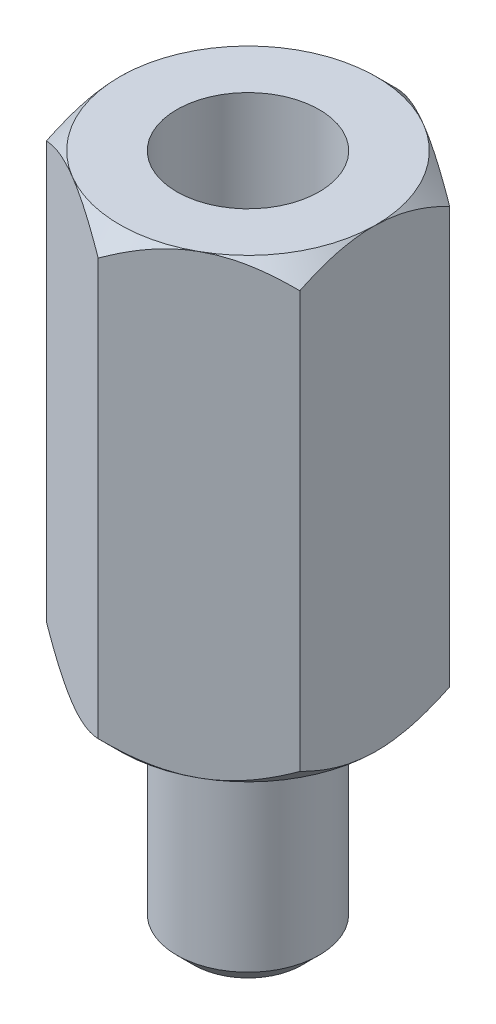
ISO-10303-21;
HEADER;
FILE_DESCRIPTION(('STEP AP214'),'2;1');
FILE_NAME('part.step','',(''),(''),'','','');
FILE_SCHEMA(('AUTOMOTIVE_DESIGN { 1 0 10303 214 1 1 1 1 }'));
ENDSEC;
DATA;
#1=APPLICATION_CONTEXT('core data for automotive mechanical design processes');
#2=APPLICATION_PROTOCOL_DEFINITION('international standard','automotive_design',2000,#1);
#3=PRODUCT_CONTEXT('',#1,'mechanical');
#4=PRODUCT('Part','Part','',(#3));
#5=PRODUCT_RELATED_PRODUCT_CATEGORY('part','',(#4));
#6=PRODUCT_DEFINITION_FORMATION('','',#4);
#7=PRODUCT_DEFINITION_CONTEXT('part definition',#1,'design');
#8=PRODUCT_DEFINITION('design','',#6,#7);
#9=PRODUCT_DEFINITION_SHAPE('','',#8);
#10=(LENGTH_UNIT() NAMED_UNIT(*) SI_UNIT(.MILLI.,.METRE.));
#11=(NAMED_UNIT(*) PLANE_ANGLE_UNIT() SI_UNIT($,.RADIAN.));
#12=(NAMED_UNIT(*) SI_UNIT($,.STERADIAN.) SOLID_ANGLE_UNIT());
#13=UNCERTAINTY_MEASURE_WITH_UNIT(LENGTH_MEASURE(1.E-05),#10,'distance_accuracy_value','');
#14=(GEOMETRIC_REPRESENTATION_CONTEXT(3) GLOBAL_UNCERTAINTY_ASSIGNED_CONTEXT((#13)) GLOBAL_UNIT_ASSIGNED_CONTEXT((#10,
#11,#12)) REPRESENTATION_CONTEXT('',''));
#15=CARTESIAN_POINT('',(0.,0.,0.));
#16=DIRECTION('',(0.,0.,1.));
#17=DIRECTION('',(1.,0.,0.));
#18=AXIS2_PLACEMENT_3D('',#15,#16,#17);
#19=CARTESIAN_POINT('',(-0.0300557189147302,11.9,2.59790235647157));
#20=DIRECTION('',(-0.489947968640831,0.,-0.871751677959225));
#21=DIRECTION('',(-0.871751677959225,0.,0.489947968640831));
#22=AXIS2_PLACEMENT_3D('',#19,#20,#21);
#23=PLANE('',#22);
#24=CARTESIAN_POINT('',(2.23502157779847,4.24819093051602,1.32486778894762));
#25=CARTESIAN_POINT('',(2.15716458197205,4.20357243492509,1.36862552169892));
#26=CARTESIAN_POINT('',(2.07800569364474,4.16157435203059,1.41311495316938));
#27=CARTESIAN_POINT('',(1.91659188989009,4.08467669127039,1.50383386689183));
#28=CARTESIAN_POINT('',(1.83432162179237,4.04981990195958,1.55007197775888));
#29=CARTESIAN_POINT('',(1.66842753139245,3.99010944650485,1.64330893348374));
#30=CARTESIAN_POINT('',(1.58484596281486,3.96510569198552,1.69028403060804));
#31=CARTESIAN_POINT('',(1.41584269948427,3.92658213293041,1.78526842542599));
#32=CARTESIAN_POINT('',(1.33042616829817,3.91303356936119,1.83327482105571));
#33=CARTESIAN_POINT('',(1.18321679018294,3.9008093174478,1.91601046423941));
#34=CARTESIAN_POINT('',(1.12161414834691,3.89899963534072,1.9506328113981));
#35=CARTESIAN_POINT('',(0.998509547206554,3.90204772238917,2.01982091941558));
#36=CARTESIAN_POINT('',(0.937007630767304,3.9069078290768,2.05438665618304));
#37=CARTESIAN_POINT('',(0.814584503718083,3.92301892411759,2.12319175737061));
#38=CARTESIAN_POINT('',(0.75366402042535,3.93427706219655,2.15743071301881));
#39=CARTESIAN_POINT('',(0.632876510933741,3.96256622895788,2.22531655299923));
#40=CARTESIAN_POINT('',(0.573009404349546,3.97959681510551,2.25896348251016));
#41=CARTESIAN_POINT('',(0.419660378321838,4.03015712347289,2.34514977350901));
#42=CARTESIAN_POINT('',(0.327129390274906,4.06749840965065,2.39715468588962));
#43=CARTESIAN_POINT('',(0.191070788012611,4.13053579851296,2.47362329212228));
#44=CARTESIAN_POINT('',(0.146233416908853,4.15268426505183,2.49882310469151));
#45=CARTESIAN_POINT('',(0.0573892502576361,4.19900022887967,2.5487559239529));
#46=CARTESIAN_POINT('',(0.0133819647894514,4.22316648644076,2.57348920599373));
#47=CARTESIAN_POINT('',(-0.03025571891473,4.24819093051602,2.59801476186889));
#48=B_SPLINE_CURVE_WITH_KNOTS('',3,(#24,#25,#26,#27,#28,#29,#30,#31,#32,#33,#34,#35,#36,#37,#38,
#39,#40,#41,#42,#43,#44,#45,#46,#47),.UNSPECIFIED.,.F.,.F.,(4,2,2,2,2,2,2,2,2,2,2,4),(0.,
0.299715989853337,0.601178407643738,0.897852627313321,1.19377979571886,1.40554521988474,
1.61738487952063,1.82946173432533,2.0415223343015,2.37837679350116,2.54634732977975,
2.71421541407178),.UNSPECIFIED.);
#49=CARTESIAN_POINT('',(2.23482157779847,4.24807621135331,1.32498019434494));
#50=VERTEX_POINT('',#49);
#51=CARTESIAN_POINT('',(1.10238292944187,3.9,1.96144127540826));
#52=VERTEX_POINT('',#51);
#53=EDGE_CURVE('E131',#50,#52,#48,.T.);
#54=ORIENTED_EDGE('',*,*,#53,.F.);
#55=DIRECTION('',(0.,-1.,0.));
#56=VECTOR('',#55,1.);
#57=CARTESIAN_POINT('',(2.23482157779847,11.9,1.32498019434494));
#58=LINE('',#57,#56);
#59=CARTESIAN_POINT('',(2.23482157779847,11.5519237886467,1.32498019434494));
#60=VERTEX_POINT('',#59);
#61=EDGE_CURVE('E373',#60,#50,#58,.T.);
#62=ORIENTED_EDGE('',*,*,#61,.F.);
#63=CARTESIAN_POINT('',(-0.0302557189147302,11.551809069484,2.59801476186889));
#64=CARTESIAN_POINT('',(0.0476012769116915,11.5964275650749,2.55425702911759));
#65=CARTESIAN_POINT('',(0.126760165238997,11.6384256479694,2.50976759764713));
#66=CARTESIAN_POINT('',(0.28817396899365,11.7153233087296,2.41904868392468));
#67=CARTESIAN_POINT('',(0.370444237091369,11.7501800980404,2.37281057305763));
#68=CARTESIAN_POINT('',(0.536338327491288,11.8098905534952,2.27957361733277));
#69=CARTESIAN_POINT('',(0.619919896068883,11.8348943080145,2.23259852020847));
#70=CARTESIAN_POINT('',(0.788923159399464,11.8734178670696,2.13761412539052));
#71=CARTESIAN_POINT('',(0.87433969058557,11.8869664306388,2.0896077297608));
#72=CARTESIAN_POINT('',(1.02154906870079,11.8991906825522,2.0068720865771));
#73=CARTESIAN_POINT('',(1.08315171053683,11.9010003646593,1.97224973941841));
#74=CARTESIAN_POINT('',(1.20625631167718,11.8979522776108,1.90306163140093));
#75=CARTESIAN_POINT('',(1.26775822811643,11.8930921709232,1.86849589463347));
#76=CARTESIAN_POINT('',(1.39018135516566,11.8769810758824,1.7996907934459));
#77=CARTESIAN_POINT('',(1.45110183845839,11.8657229378034,1.7654518377977));
#78=CARTESIAN_POINT('',(1.57188934795,11.8374337710421,1.69756599781728));
#79=CARTESIAN_POINT('',(1.63175645453419,11.8204031848945,1.66391906830635));
#80=CARTESIAN_POINT('',(1.7851054805619,11.7698428765271,1.5777327773075));
#81=CARTESIAN_POINT('',(1.87763646860883,11.7325015903494,1.52572786492689));
#82=CARTESIAN_POINT('',(2.01369507087113,11.669464201487,1.44925925869423));
#83=CARTESIAN_POINT('',(2.05853244197488,11.6473157349482,1.424059446125));
#84=CARTESIAN_POINT('',(2.1473766086261,11.6009997711203,1.37412662686361));
#85=CARTESIAN_POINT('',(2.19138389409429,11.5768335135592,1.34939334482278));
#86=CARTESIAN_POINT('',(2.23502157779847,11.551809069484,1.32486778894762));
#87=B_SPLINE_CURVE_WITH_KNOTS('',3,(#63,#64,#65,#66,#67,#68,#69,#70,#71,#72,#73,#74,#75,#76,#77,
#78,#79,#80,#81,#82,#83,#84,#85,#86),.UNSPECIFIED.,.F.,.F.,(4,2,2,2,2,2,2,2,2,2,2,4),(0.,
0.299715989853337,0.601178407643739,0.897852627313321,1.19377979571886,1.40554521988474,
1.61738487952063,1.82946173432533,2.0415223343015,2.37837679350116,2.54634732977975,
2.71421541407178),.UNSPECIFIED.);
#88=CARTESIAN_POINT('',(1.10238292944187,11.9,1.96144127540826));
#89=VERTEX_POINT('',#88);
#90=EDGE_CURVE('E332',#89,#60,#87,.T.);
#91=ORIENTED_EDGE('',*,*,#90,.F.);
#92=CARTESIAN_POINT('',(-0.0300557189147301,11.5519237886467,2.59790235647157));
#93=VERTEX_POINT('',#92);
#94=EDGE_CURVE('E586',#93,#89,#87,.T.);
#95=ORIENTED_EDGE('',*,*,#94,.F.);
#96=DIRECTION('',(0.,-1.,0.));
#97=VECTOR('',#96,1.);
#98=CARTESIAN_POINT('',(-0.0300557189147302,11.9,2.59790235647157));
#99=LINE('',#98,#97);
#100=CARTESIAN_POINT('',(-0.0300557189147301,4.24807621135331,2.59790235647157));
#101=VERTEX_POINT('',#100);
#102=EDGE_CURVE('E168',#93,#101,#99,.T.);
#103=ORIENTED_EDGE('',*,*,#102,.T.);
#104=EDGE_CURVE('E145',#52,#101,#48,.T.);
#105=ORIENTED_EDGE('',*,*,#104,.F.);
#106=EDGE_LOOP('',(#54,#62,#91,#95,#103,#105));
#107=FACE_BOUND('',#106,.T.);
#108=ADVANCED_FACE('F41',(#107),#23,.F.);
#109=CARTESIAN_POINT('',(2.23482157779847,11.9,1.32498019434494));
#110=DIRECTION('',(-0.999933083224815,0.,-0.0115684516040711));
#111=DIRECTION('',(-0.0115684516040711,0.,0.999933083224815));
#112=AXIS2_PLACEMENT_3D('',#109,#110,#111);
#113=PLANE('',#112);
#114=CARTESIAN_POINT('',(2.26487961055835,4.24817622381949,-1.27312216212662));
#115=CARTESIAN_POINT('',(2.26384644133312,4.203559365371,-1.1838189325987));
#116=CARTESIAN_POINT('',(2.26279599608658,4.16156289259725,-1.09302242930872));
#117=CARTESIAN_POINT('',(2.26065402225076,4.08466830346417,-0.907878334390154));
#118=CARTESIAN_POINT('',(2.25956228994836,4.04981297180902,-0.813513134573057));
#119=CARTESIAN_POINT('',(2.25736086380444,3.99010508262032,-0.623230207616468));
#120=CARTESIAN_POINT('',(2.25625173062468,3.96510244943294,-0.527360941953281));
#121=CARTESIAN_POINT('',(2.25400904666603,3.92658068368613,-0.333511845961814));
#122=CARTESIAN_POINT('',(2.25287556440039,3.91303279515457,-0.235537937658898));
#123=CARTESIAN_POINT('',(2.25092207059147,3.90080910466964,-0.0666853414542392));
#124=CARTESIAN_POINT('',(2.25010458283484,3.89899958808433,0.00397519990113925));
#125=CARTESIAN_POINT('',(2.24847094359848,3.90204798741226,0.145180779904412));
#126=CARTESIAN_POINT('',(2.24765479268763,3.90690824078287,0.215725769380518));
#127=CARTESIAN_POINT('',(2.24603019722834,3.9230196012817,0.356149639592349));
#128=CARTESIAN_POINT('',(2.24522176233102,3.93427785753943,0.426027686121452));
#129=CARTESIAN_POINT('',(2.24361887232874,3.9625672296575,0.564575418947657));
#130=CARTESIAN_POINT('',(2.24282441615696,3.97959790295998,0.633245197455443));
#131=CARTESIAN_POINT('',(2.24078949128023,4.03015673253342,0.809136386333505));
#132=CARTESIAN_POINT('',(2.23956163953716,4.0674957520101,0.915267234368551));
#133=CARTESIAN_POINT('',(2.23775619069175,4.13052905831226,1.07132338538929));
#134=CARTESIAN_POINT('',(2.23716121459372,4.15267605050089,1.12275086285141));
#135=CARTESIAN_POINT('',(2.23598228321833,4.1989888893654,1.22465321983559));
#136=CARTESIAN_POINT('',(2.23539832144177,4.22315349672234,1.27512866112216));
#137=CARTESIAN_POINT('',(2.23481926395331,4.24817622381949,1.32518019434494));
#138=B_SPLINE_CURVE_WITH_KNOTS('',3,(#114,#115,#116,#117,#118,#119,#120,#121,#122,#123,#124,
#125,#126,#127,#128,#129,#130,#131,#132,#133,#134,#135,#136,#137),.UNSPECIFIED.,.F.,.F.,(4,2,2,
2,2,2,2,2,2,2,2,4),(0.,0.29970902049501,0.601164312582219,0.897831775426419,1.19375225461377,
1.40551741111242,1.61735680082442,1.82943336664721,2.0414936767269,2.37832959767405,
2.54629086108272,2.71414970286407),.UNSPECIFIED.);
#139=CARTESIAN_POINT('',(2.2648772967132,4.24807621135331,-1.27292216212662));
#140=VERTEX_POINT('',#139);
#141=CARTESIAN_POINT('',(2.24984943725583,3.9,0.0260290161091599));
#142=VERTEX_POINT('',#141);
#143=EDGE_CURVE('E57',#140,#142,#138,.T.);
#144=ORIENTED_EDGE('',*,*,#143,.F.);
#145=DIRECTION('',(0.,-1.,0.));
#146=VECTOR('',#145,1.);
#147=CARTESIAN_POINT('',(2.2648772967132,11.9,-1.27292216212662));
#148=LINE('',#147,#146);
#149=CARTESIAN_POINT('',(2.2648772967132,11.5519237886467,-1.27292216212662));
#150=VERTEX_POINT('',#149);
#151=EDGE_CURVE('E325',#150,#140,#148,.T.);
#152=ORIENTED_EDGE('',*,*,#151,.F.);
#153=CARTESIAN_POINT('',(2.23481926395331,11.5518237761805,1.32518019434494));
#154=CARTESIAN_POINT('',(2.23585243317855,11.596440634629,1.23587696481702));
#155=CARTESIAN_POINT('',(2.23690287842508,11.6384371074028,1.14508046152704));
#156=CARTESIAN_POINT('',(2.23904485226091,11.7153316965358,0.959936366608474));
#157=CARTESIAN_POINT('',(2.24013658456331,11.750187028191,0.865571166791377));
#158=CARTESIAN_POINT('',(2.24233801070722,11.8098949173797,0.675288239834788));
#159=CARTESIAN_POINT('',(2.24344714388698,11.8348975505671,0.579418974171601));
#160=CARTESIAN_POINT('',(2.24568982784563,11.8734193163139,0.385569878180134));
#161=CARTESIAN_POINT('',(2.24682331011127,11.8869672048454,0.287595969877218));
#162=CARTESIAN_POINT('',(2.24877680392019,11.8991908953304,0.118743373672559));
#163=CARTESIAN_POINT('',(2.24959429167683,11.9010004119157,0.0480828323171811));
#164=CARTESIAN_POINT('',(2.25122793091319,11.8979520125877,-0.0931227476860912));
#165=CARTESIAN_POINT('',(2.25204408182404,11.8930917592171,-0.163667737162197));
#166=CARTESIAN_POINT('',(2.25366867728333,11.8769803987183,-0.304091607374029));
#167=CARTESIAN_POINT('',(2.25447711218065,11.8657221424606,-0.373969653903131));
#168=CARTESIAN_POINT('',(2.25608000218293,11.8374327703425,-0.512517386729336));
#169=CARTESIAN_POINT('',(2.2568744583547,11.82040209704,-0.581187165237122));
#170=CARTESIAN_POINT('',(2.25890938323143,11.7698432674666,-0.757078354115184));
#171=CARTESIAN_POINT('',(2.2601372349745,11.7325042479899,-0.86320920215023));
#172=CARTESIAN_POINT('',(2.26194268381992,11.6694709416877,-1.01926535317097));
#173=CARTESIAN_POINT('',(2.26253765991794,11.6473239494991,-1.07069283063309));
#174=CARTESIAN_POINT('',(2.26371659129334,11.6010111106346,-1.17259518761726));
#175=CARTESIAN_POINT('',(2.2643005530699,11.5768465032777,-1.22307062890384));
#176=CARTESIAN_POINT('',(2.26487961055835,11.5518237761805,-1.27312216212662));
#177=B_SPLINE_CURVE_WITH_KNOTS('',3,(#153,#154,#155,#156,#157,#158,#159,#160,#161,#162,#163,
#164,#165,#166,#167,#168,#169,#170,#171,#172,#173,#174,#175,#176),.UNSPECIFIED.,.F.,.F.,(4,2,2,
2,2,2,2,2,2,2,2,4),(0.,0.299709020495011,0.60116431258222,0.89783177542642,1.19375225461377,
1.40551741111242,1.61735680082442,1.82943336664721,2.0414936767269,2.37832959767405,
2.54629086108272,2.71414970286407),.UNSPECIFIED.);
#178=CARTESIAN_POINT('',(2.24984943725583,11.9,0.0260290161091599));
#179=VERTEX_POINT('',#178);
#180=EDGE_CURVE('E283',#179,#150,#177,.T.);
#181=ORIENTED_EDGE('',*,*,#180,.F.);
#182=EDGE_CURVE('E323',#60,#179,#177,.T.);
#183=ORIENTED_EDGE('',*,*,#182,.F.);
#184=ORIENTED_EDGE('',*,*,#61,.T.);
#185=EDGE_CURVE('E138',#142,#50,#138,.T.);
#186=ORIENTED_EDGE('',*,*,#185,.F.);
#187=EDGE_LOOP('',(#144,#152,#181,#183,#184,#186));
#188=FACE_BOUND('',#187,.T.);
#189=ADVANCED_FACE('F276',(#188),#113,.F.);
#190=CARTESIAN_POINT('',(2.2648772967132,11.9,-1.27292216212662));
#191=DIRECTION('',(-0.509985114583984,0.,0.860183226355153));
#192=DIRECTION('',(0.860183226355153,0.,0.509985114583984));
#193=AXIS2_PLACEMENT_3D('',#190,#191,#192);
#194=PLANE('',#193);
#195=CARTESIAN_POINT('',(0.0298557189147295,4.24819247345722,-2.59802093239794));
#196=CARTESIAN_POINT('',(0.106679685029149,4.20357380610538,-2.55247356764907));
#197=CARTESIAN_POINT('',(0.184788271366595,4.16157555428499,-2.50616457773528));
#198=CARTESIAN_POINT('',(0.34406040158201,4.08467757126502,-2.41173537580568));
#199=CARTESIAN_POINT('',(0.425239094568443,4.04982062902437,-2.36360618219203));
#200=CARTESIAN_POINT('',(0.588932077297948,3.99010990433076,-2.26655594685131));
#201=CARTESIAN_POINT('',(0.671404673569839,3.96510603216767,-2.2176596243341));
#202=CARTESIAN_POINT('',(0.83816558504726,3.92658228497004,-2.11879047652671));
#203=CARTESIAN_POINT('',(0.922448805137255,3.91303365058088,-2.06882067202676));
#204=CARTESIAN_POINT('',(1.06770486935486,3.90080933976933,-1.98270131014624));
#205=CARTESIAN_POINT('',(1.12849003012289,3.8989996402986,-1.94666302640681));
#206=CARTESIAN_POINT('',(1.24996100665717,3.90204769458859,-1.87464535855602));
#207=CARTESIAN_POINT('',(1.31064678012754,3.90690778588922,-1.83866599952103));
#208=CARTESIAN_POINT('',(1.43144532890472,3.92301885308403,-1.76704700039134));
#209=CARTESIAN_POINT('',(1.49155738654112,3.93427697876657,-1.7314077857888));
#210=CARTESIAN_POINT('',(1.61074202482456,3.96256612398742,-1.6607456413185));
#211=CARTESIAN_POINT('',(1.66981468478967,3.97959670099342,-1.62572266442468));
#212=CARTESIAN_POINT('',(1.82112926658123,4.03015716450646,-1.53601133087523));
#213=CARTESIAN_POINT('',(1.91243285879002,4.0674986884906,-1.48187929073788));
#214=CARTESIAN_POINT('',(2.04668666981562,4.13053650566636,-1.4022829406796));
#215=CARTESIAN_POINT('',(2.09092927971393,4.15268512688367,-1.37605239841003));
#216=CARTESIAN_POINT('',(2.17859493655025,4.19900141856044,-1.32407721605709));
#217=CARTESIAN_POINT('',(2.22201846692503,4.22316784924909,-1.2983322893539));
#218=CARTESIAN_POINT('',(2.2650772967132,4.24819247345722,-1.27280358620025));
#219=B_SPLINE_CURVE_WITH_KNOTS('',3,(#195,#196,#197,#198,#199,#200,#201,#202,#203,#204,#205,
#206,#207,#208,#209,#210,#211,#212,#213,#214,#215,#216,#217,#218),.UNSPECIFIED.,.F.,.F.,(4,2,2,
2,2,2,2,2,2,2,2,4),(0.,0.299716721047192,0.601179886434929,0.897854814999671,1.19378268520711,
1.40554813745878,1.61738782541724,1.82946471054394,2.04152534093802,2.37838174501216,
2.54635325412113,2.71422230805823),.UNSPECIFIED.);
#220=CARTESIAN_POINT('',(0.0300557189147295,4.24807621135331,-2.59790235647157));
#221=VERTEX_POINT('',#220);
#222=CARTESIAN_POINT('',(1.14746650781396,3.9,-1.93541225929909));
#223=VERTEX_POINT('',#222);
#224=EDGE_CURVE('E65',#221,#223,#219,.T.);
#225=ORIENTED_EDGE('',*,*,#224,.F.);
#226=DIRECTION('',(0.,-1.,0.));
#227=VECTOR('',#226,1.);
#228=CARTESIAN_POINT('',(0.0300557189147295,11.9,-2.59790235647157));
#229=LINE('',#228,#227);
#230=CARTESIAN_POINT('',(0.0300557189147295,11.5519237886467,-2.59790235647157));
#231=VERTEX_POINT('',#230);
#232=EDGE_CURVE('E361',#231,#221,#229,.T.);
#233=ORIENTED_EDGE('',*,*,#232,.F.);
#234=CARTESIAN_POINT('',(2.2650772967132,11.5518075265428,-1.27280358620025));
#235=CARTESIAN_POINT('',(2.18825333059878,11.5964261938946,-1.31835095094912));
#236=CARTESIAN_POINT('',(2.11014474426133,11.638424445715,-1.36465994086291));
#237=CARTESIAN_POINT('',(1.95087261404592,11.715322428735,-1.45908914279251));
#238=CARTESIAN_POINT('',(1.86969392105948,11.7501793709756,-1.50721833640616));
#239=CARTESIAN_POINT('',(1.70600093832998,11.8098900956692,-1.60426857174688));
#240=CARTESIAN_POINT('',(1.62352834205809,11.8348939678323,-1.65316489426409));
#241=CARTESIAN_POINT('',(1.45676743058067,11.87341771503,-1.75203404207148));
#242=CARTESIAN_POINT('',(1.37248421049067,11.8869663494191,-1.80200384657143));
#243=CARTESIAN_POINT('',(1.22722814627307,11.8991906602307,-1.88812320845195));
#244=CARTESIAN_POINT('',(1.16644298550504,11.9010003597014,-1.92416149219138));
#245=CARTESIAN_POINT('',(1.04497200897076,11.8979523054114,-1.99617916004217));
#246=CARTESIAN_POINT('',(0.984286235500385,11.8930922141108,-2.03215851907716));
#247=CARTESIAN_POINT('',(0.863487686723208,11.876981146916,-2.10377751820685));
#248=CARTESIAN_POINT('',(0.803375629086807,11.8657230212334,-2.13941673280939));
#249=CARTESIAN_POINT('',(0.684190990803368,11.8374338760126,-2.21007887727969));
#250=CARTESIAN_POINT('',(0.625118330838257,11.8204032990066,-2.24510185417351));
#251=CARTESIAN_POINT('',(0.4738037490467,11.7698428354935,-2.33481318772296));
#252=CARTESIAN_POINT('',(0.38250015683791,11.7325013115094,-2.38894522786031));
#253=CARTESIAN_POINT('',(0.248246345812309,11.6694634943336,-2.46854157791859));
#254=CARTESIAN_POINT('',(0.204003735913997,11.6473148731163,-2.49477212018816));
#255=CARTESIAN_POINT('',(0.116338079077681,11.6009985814396,-2.5467473025411));
#256=CARTESIAN_POINT('',(0.0729145487028977,11.5768321507509,-2.57249222924429));
#257=CARTESIAN_POINT('',(0.0298557189147291,11.5518075265428,-2.59802093239794));
#258=B_SPLINE_CURVE_WITH_KNOTS('',3,(#234,#235,#236,#237,#238,#239,#240,#241,#242,#243,#244,
#245,#246,#247,#248,#249,#250,#251,#252,#253,#254,#255,#256,#257),.UNSPECIFIED.,.F.,.F.,(4,2,2,
2,2,2,2,2,2,2,2,4),(0.,0.299716721047193,0.60117988643493,0.897854814999672,1.19378268520711,
1.40554813745878,1.61738782541724,1.82946471054394,2.04152534093802,2.37838174501216,
2.54635325412113,2.71422230805823),.UNSPECIFIED.);
#259=CARTESIAN_POINT('',(1.14746650781396,11.9,-1.93541225929909));
#260=VERTEX_POINT('',#259);
#261=EDGE_CURVE('E262',#260,#231,#258,.T.);
#262=ORIENTED_EDGE('',*,*,#261,.F.);
#263=EDGE_CURVE('E329',#150,#260,#258,.T.);
#264=ORIENTED_EDGE('',*,*,#263,.F.);
#265=ORIENTED_EDGE('',*,*,#151,.T.);
#266=EDGE_CURVE('E209',#223,#140,#219,.T.);
#267=ORIENTED_EDGE('',*,*,#266,.F.);
#268=EDGE_LOOP('',(#225,#233,#262,#264,#265,#267));
#269=FACE_BOUND('',#268,.T.);
#270=ADVANCED_FACE('F271',(#269),#194,.F.);
#271=CARTESIAN_POINT('',(0.0300557189147295,11.9,-2.59790235647157));
#272=DIRECTION('',(0.489947968640831,0.,0.871751677959224));
#273=DIRECTION('',(0.871751677959225,0.,-0.489947968640831));
#274=AXIS2_PLACEMENT_3D('',#271,#272,#273);
#275=PLANE('',#274);
#276=CARTESIAN_POINT('',(-2.23502157779847,4.24819093051602,-1.32486778894762));
#277=CARTESIAN_POINT('',(-2.15716458197205,4.20357243492509,-1.36862552169892));
#278=CARTESIAN_POINT('',(-2.07800569364474,4.16157435203059,-1.41311495316938));
#279=CARTESIAN_POINT('',(-1.91659188989009,4.08467669127039,-1.50383386689183));
#280=CARTESIAN_POINT('',(-1.83432162179237,4.04981990195958,-1.55007197775888));
#281=CARTESIAN_POINT('',(-1.66842753139245,3.99010944650485,-1.64330893348374));
#282=CARTESIAN_POINT('',(-1.58484596281486,3.96510569198552,-1.69028403060804));
#283=CARTESIAN_POINT('',(-1.41584269948428,3.92658213293041,-1.78526842542599));
#284=CARTESIAN_POINT('',(-1.33042616829817,3.91303356936119,-1.83327482105571));
#285=CARTESIAN_POINT('',(-1.18321679018294,3.9008093174478,-1.91601046423941));
#286=CARTESIAN_POINT('',(-1.12161414834691,3.89899963534072,-1.9506328113981));
#287=CARTESIAN_POINT('',(-0.998509547206554,3.90204772238917,-2.01982091941558));
#288=CARTESIAN_POINT('',(-0.937007630767304,3.9069078290768,-2.05438665618304));
#289=CARTESIAN_POINT('',(-0.814584503718083,3.92301892411759,-2.12319175737061));
#290=CARTESIAN_POINT('',(-0.753664020425351,3.93427706219655,-2.15743071301881));
#291=CARTESIAN_POINT('',(-0.632876510933742,3.96256622895788,-2.22531655299923));
#292=CARTESIAN_POINT('',(-0.573009404349547,3.97959681510551,-2.25896348251016));
#293=CARTESIAN_POINT('',(-0.419660378321838,4.03015712347289,-2.34514977350901));
#294=CARTESIAN_POINT('',(-0.327129390274907,4.06749840965065,-2.39715468588962));
#295=CARTESIAN_POINT('',(-0.191070788012612,4.13053579851296,-2.47362329212228));
#296=CARTESIAN_POINT('',(-0.146233416908854,4.15268426505183,-2.49882310469151));
#297=CARTESIAN_POINT('',(-0.0573892502576364,4.19900022887967,-2.5487559239529));
#298=CARTESIAN_POINT('',(-0.0133819647894518,4.22316648644076,-2.57348920599373));
#299=CARTESIAN_POINT('',(0.0302557189147293,4.24819093051602,-2.59801476186889));
#300=B_SPLINE_CURVE_WITH_KNOTS('',3,(#276,#277,#278,#279,#280,#281,#282,#283,#284,#285,#286,
#287,#288,#289,#290,#291,#292,#293,#294,#295,#296,#297,#298,#299),.UNSPECIFIED.,.F.,.F.,(4,2,2,
2,2,2,2,2,2,2,2,4),(0.,0.299715989853336,0.601178407643738,0.897852627313319,1.19377979571886,
1.40554521988474,1.61738487952062,1.82946173432533,2.0415223343015,2.37837679350116,
2.54634732977975,2.71421541407178),.UNSPECIFIED.);
#301=CARTESIAN_POINT('',(-2.23482157779847,4.24807621135331,-1.32498019434494));
#302=VERTEX_POINT('',#301);
#303=CARTESIAN_POINT('',(-1.10238292944187,3.9,-1.96144127540826));
#304=VERTEX_POINT('',#303);
#305=EDGE_CURVE('E186',#302,#304,#300,.T.);
#306=ORIENTED_EDGE('',*,*,#305,.F.);
#307=DIRECTION('',(0.,-1.,0.));
#308=VECTOR('',#307,1.);
#309=CARTESIAN_POINT('',(-2.23482157779847,11.9,-1.32498019434494));
#310=LINE('',#309,#308);
#311=CARTESIAN_POINT('',(-2.23482157779847,11.5519237886467,-1.32498019434494));
#312=VERTEX_POINT('',#311);
#313=EDGE_CURVE('E357',#312,#302,#310,.T.);
#314=ORIENTED_EDGE('',*,*,#313,.F.);
#315=CARTESIAN_POINT('',(0.0302557189147295,11.551809069484,-2.59801476186889));
#316=CARTESIAN_POINT('',(-0.0476012769116925,11.5964275650749,-2.55425702911759));
#317=CARTESIAN_POINT('',(-0.126760165238997,11.6384256479694,-2.50976759764713));
#318=CARTESIAN_POINT('',(-0.28817396899365,11.7153233087296,-2.41904868392468));
#319=CARTESIAN_POINT('',(-0.370444237091368,11.7501800980404,-2.37281057305763));
#320=CARTESIAN_POINT('',(-0.536338327491288,11.8098905534952,-2.27957361733277));
#321=CARTESIAN_POINT('',(-0.619919896068883,11.8348943080145,-2.23259852020847));
#322=CARTESIAN_POINT('',(-0.788923159399464,11.8734178670696,-2.13761412539052));
#323=CARTESIAN_POINT('',(-0.87433969058557,11.8869664306388,-2.08960772976081));
#324=CARTESIAN_POINT('',(-1.02154906870079,11.8991906825522,-2.0068720865771));
#325=CARTESIAN_POINT('',(-1.08315171053683,11.9010003646593,-1.97224973941841));
#326=CARTESIAN_POINT('',(-1.20625631167718,11.8979522776108,-1.90306163140093));
#327=CARTESIAN_POINT('',(-1.26775822811643,11.8930921709232,-1.86849589463347));
#328=CARTESIAN_POINT('',(-1.39018135516566,11.8769810758824,-1.7996907934459));
#329=CARTESIAN_POINT('',(-1.45110183845839,11.8657229378034,-1.7654518377977));
#330=CARTESIAN_POINT('',(-1.57188934795,11.8374337710421,-1.69756599781728));
#331=CARTESIAN_POINT('',(-1.63175645453419,11.8204031848945,-1.66391906830635));
#332=CARTESIAN_POINT('',(-1.7851054805619,11.7698428765271,-1.5777327773075));
#333=CARTESIAN_POINT('',(-1.87763646860883,11.7325015903494,-1.52572786492689));
#334=CARTESIAN_POINT('',(-2.01369507087113,11.669464201487,-1.44925925869423));
#335=CARTESIAN_POINT('',(-2.05853244197488,11.6473157349482,-1.42405944612501));
#336=CARTESIAN_POINT('',(-2.1473766086261,11.6009997711203,-1.37412662686362));
#337=CARTESIAN_POINT('',(-2.19138389409429,11.5768335135592,-1.34939334482278));
#338=CARTESIAN_POINT('',(-2.23502157779847,11.551809069484,-1.32486778894762));
#339=B_SPLINE_CURVE_WITH_KNOTS('',3,(#315,#316,#317,#318,#319,#320,#321,#322,#323,#324,#325,
#326,#327,#328,#329,#330,#331,#332,#333,#334,#335,#336,#337,#338),.UNSPECIFIED.,.F.,.F.,(4,2,2,
2,2,2,2,2,2,2,2,4),(0.,0.299715989853336,0.601178407643738,0.89785262731332,1.19377979571886,
1.40554521988474,1.61738487952062,1.82946173432533,2.0415223343015,2.37837679350116,
2.54634732977975,2.71421541407178),.UNSPECIFIED.);
#340=CARTESIAN_POINT('',(-1.10238292944187,11.9,-1.96144127540826));
#341=VERTEX_POINT('',#340);
#342=EDGE_CURVE('E254',#341,#312,#339,.T.);
#343=ORIENTED_EDGE('',*,*,#342,.F.);
#344=EDGE_CURVE('E261',#231,#341,#339,.T.);
#345=ORIENTED_EDGE('',*,*,#344,.F.);
#346=ORIENTED_EDGE('',*,*,#232,.T.);
#347=EDGE_CURVE('E296',#304,#221,#300,.T.);
#348=ORIENTED_EDGE('',*,*,#347,.F.);
#349=EDGE_LOOP('',(#306,#314,#343,#345,#346,#348));
#350=FACE_BOUND('',#349,.T.);
#351=ADVANCED_FACE('F268',(#350),#275,.F.);
#352=CARTESIAN_POINT('',(-2.23482157779847,11.9,-1.32498019434494));
#353=DIRECTION('',(0.999933083224815,0.,0.0115684516040717));
#354=DIRECTION('',(0.0115684516040717,0.,-0.999933083224815));
#355=AXIS2_PLACEMENT_3D('',#352,#353,#354);
#356=PLANE('',#355);
#357=CARTESIAN_POINT('',(-2.26487961055835,4.24817622381949,1.27312216212662));
#358=CARTESIAN_POINT('',(-2.26384644133312,4.203559365371,1.1838189325987));
#359=CARTESIAN_POINT('',(-2.26279599608658,4.16156289259725,1.09302242930872));
#360=CARTESIAN_POINT('',(-2.26065402225076,4.08466830346417,0.907878334390153));
#361=CARTESIAN_POINT('',(-2.25956228994836,4.04981297180902,0.813513134573056));
#362=CARTESIAN_POINT('',(-2.25736086380444,3.99010508262032,0.623230207616466));
#363=CARTESIAN_POINT('',(-2.25625173062468,3.96510244943294,0.52736094195328));
#364=CARTESIAN_POINT('',(-2.25400904666603,3.92658068368613,0.333511845961812));
#365=CARTESIAN_POINT('',(-2.25287556440039,3.91303279515457,0.235537937658896));
#366=CARTESIAN_POINT('',(-2.25092207059147,3.90080910466964,0.0666853414542378));
#367=CARTESIAN_POINT('',(-2.25010458283484,3.89899958808433,-0.00397519990114059));
#368=CARTESIAN_POINT('',(-2.24847094359848,3.90204798741226,-0.145180779904413));
#369=CARTESIAN_POINT('',(-2.24765479268763,3.90690824078287,-0.215725769380519));
#370=CARTESIAN_POINT('',(-2.24603019722834,3.9230196012817,-0.356149639592351));
#371=CARTESIAN_POINT('',(-2.24522176233102,3.93427785753943,-0.426027686121453));
#372=CARTESIAN_POINT('',(-2.24361887232874,3.9625672296575,-0.564575418947659));
#373=CARTESIAN_POINT('',(-2.24282441615696,3.97959790295998,-0.633245197455444));
#374=CARTESIAN_POINT('',(-2.24078949128023,4.03015673253342,-0.809136386333506));
#375=CARTESIAN_POINT('',(-2.23956163953716,4.0674957520101,-0.915267234368553));
#376=CARTESIAN_POINT('',(-2.23775619069175,4.13052905831226,-1.07132338538929));
#377=CARTESIAN_POINT('',(-2.23716121459372,4.15267605050089,-1.12275086285141));
#378=CARTESIAN_POINT('',(-2.23598228321833,4.1989888893654,-1.22465321983559));
#379=CARTESIAN_POINT('',(-2.23539832144177,4.22315349672234,-1.27512866112216));
#380=CARTESIAN_POINT('',(-2.23481926395331,4.24817622381949,-1.32518019434494));
#381=B_SPLINE_CURVE_WITH_KNOTS('',3,(#357,#358,#359,#360,#361,#362,#363,#364,#365,#366,#367,
#368,#369,#370,#371,#372,#373,#374,#375,#376,#377,#378,#379,#380),.UNSPECIFIED.,.F.,.F.,(4,2,2,
2,2,2,2,2,2,2,2,4),(0.,0.299709020495011,0.60116431258222,0.89783177542642,1.19375225461377,
1.40551741111242,1.61735680082442,1.82943336664721,2.0414936767269,2.37832959767405,
2.54629086108273,2.71414970286407),.UNSPECIFIED.);
#382=CARTESIAN_POINT('',(-2.2648772967132,4.24807621135331,1.27292216212662));
#383=VERTEX_POINT('',#382);
#384=CARTESIAN_POINT('',(-2.24984943725583,3.9,-0.0260290161091614));
#385=VERTEX_POINT('',#384);
#386=EDGE_CURVE('E170',#383,#385,#381,.T.);
#387=ORIENTED_EDGE('',*,*,#386,.F.);
#388=DIRECTION('',(0.,-1.,0.));
#389=VECTOR('',#388,1.);
#390=CARTESIAN_POINT('',(-2.2648772967132,11.9,1.27292216212662));
#391=LINE('',#390,#389);
#392=CARTESIAN_POINT('',(-2.2648772967132,11.5519237886467,1.27292216212662));
#393=VERTEX_POINT('',#392);
#394=EDGE_CURVE('E362',#393,#383,#391,.T.);
#395=ORIENTED_EDGE('',*,*,#394,.F.);
#396=CARTESIAN_POINT('',(-2.23481926395331,11.5518237761805,-1.32518019434494));
#397=CARTESIAN_POINT('',(-2.23585243317855,11.596440634629,-1.23587696481702));
#398=CARTESIAN_POINT('',(-2.23690287842508,11.6384371074028,-1.14508046152704));
#399=CARTESIAN_POINT('',(-2.23904485226091,11.7153316965358,-0.959936366608477));
#400=CARTESIAN_POINT('',(-2.24013658456331,11.750187028191,-0.865571166791379));
#401=CARTESIAN_POINT('',(-2.24233801070722,11.8098949173797,-0.67528823983479));
#402=CARTESIAN_POINT('',(-2.24344714388698,11.8348975505671,-0.579418974171604));
#403=CARTESIAN_POINT('',(-2.24568982784563,11.8734193163139,-0.385569878180136));
#404=CARTESIAN_POINT('',(-2.24682331011127,11.8869672048454,-0.287595969877221));
#405=CARTESIAN_POINT('',(-2.24877680392019,11.8991908953304,-0.118743373672562));
#406=CARTESIAN_POINT('',(-2.24959429167683,11.9010004119157,-0.0480828323171838));
#407=CARTESIAN_POINT('',(-2.25122793091319,11.8979520125877,0.0931227476860887));
#408=CARTESIAN_POINT('',(-2.25204408182404,11.8930917592171,0.163667737162195));
#409=CARTESIAN_POINT('',(-2.25366867728333,11.8769803987183,0.304091607374026));
#410=CARTESIAN_POINT('',(-2.25447711218065,11.8657221424606,0.373969653903129));
#411=CARTESIAN_POINT('',(-2.25608000218293,11.8374327703425,0.512517386729334));
#412=CARTESIAN_POINT('',(-2.2568744583547,11.82040209704,0.581187165237119));
#413=CARTESIAN_POINT('',(-2.25890938323143,11.7698432674666,0.757078354115182));
#414=CARTESIAN_POINT('',(-2.26013723497451,11.7325042479899,0.863209202150228));
#415=CARTESIAN_POINT('',(-2.26194268381992,11.6694709416877,1.01926535317097));
#416=CARTESIAN_POINT('',(-2.26253765991794,11.6473239494991,1.07069283063308));
#417=CARTESIAN_POINT('',(-2.26371659129334,11.6010111106346,1.17259518761726));
#418=CARTESIAN_POINT('',(-2.2643005530699,11.5768465032777,1.22307062890383));
#419=CARTESIAN_POINT('',(-2.26487961055835,11.5518237761805,1.27312216212662));
#420=B_SPLINE_CURVE_WITH_KNOTS('',3,(#396,#397,#398,#399,#400,#401,#402,#403,#404,#405,#406,
#407,#408,#409,#410,#411,#412,#413,#414,#415,#416,#417,#418,#419),.UNSPECIFIED.,.F.,.F.,(4,2,2,
2,2,2,2,2,2,2,2,4),(0.,0.29970902049501,0.601164312582219,0.897831775426418,1.19375225461376,
1.40551741111242,1.61735680082442,1.82943336664721,2.0414936767269,2.37832959767405,
2.54629086108272,2.71414970286407),.UNSPECIFIED.);
#421=CARTESIAN_POINT('',(-2.24984943725583,11.9,-0.0260290161091614));
#422=VERTEX_POINT('',#421);
#423=EDGE_CURVE('E246',#422,#393,#420,.T.);
#424=ORIENTED_EDGE('',*,*,#423,.F.);
#425=EDGE_CURVE('E253',#312,#422,#420,.T.);
#426=ORIENTED_EDGE('',*,*,#425,.F.);
#427=ORIENTED_EDGE('',*,*,#313,.T.);
#428=EDGE_CURVE('E144',#385,#302,#381,.T.);
#429=ORIENTED_EDGE('',*,*,#428,.F.);
#430=EDGE_LOOP('',(#387,#395,#424,#426,#427,#429));
#431=FACE_BOUND('',#430,.T.);
#432=ADVANCED_FACE('F231',(#431),#356,.F.);
#433=CARTESIAN_POINT('',(-2.2648772967132,11.9,1.27292216212662));
#434=DIRECTION('',(0.509985114583984,0.,-0.860183226355153));
#435=DIRECTION('',(-0.860183226355153,0.,-0.509985114583984));
#436=AXIS2_PLACEMENT_3D('',#433,#434,#435);
#437=PLANE('',#436);
#438=CARTESIAN_POINT('',(-0.0298557189147302,4.24819247345722,2.59802093239794));
#439=CARTESIAN_POINT('',(-0.106679685029149,4.20357380610538,2.55247356764907));
#440=CARTESIAN_POINT('',(-0.184788271366596,4.16157555428499,2.50616457773528));
#441=CARTESIAN_POINT('',(-0.34406040158201,4.08467757126502,2.41173537580568));
#442=CARTESIAN_POINT('',(-0.425239094568443,4.04982062902437,2.36360618219203));
#443=CARTESIAN_POINT('',(-0.588932077297949,3.99010990433076,2.26655594685131));
#444=CARTESIAN_POINT('',(-0.67140467356984,3.96510603216767,2.2176596243341));
#445=CARTESIAN_POINT('',(-0.838165585047261,3.92658228497004,2.11879047652671));
#446=CARTESIAN_POINT('',(-0.922448805137257,3.91303365058088,2.06882067202676));
#447=CARTESIAN_POINT('',(-1.06770486935486,3.90080933976933,1.98270131014624));
#448=CARTESIAN_POINT('',(-1.12849003012289,3.8989996402986,1.94666302640681));
#449=CARTESIAN_POINT('',(-1.24996100665717,3.90204769458859,1.87464535855602));
#450=CARTESIAN_POINT('',(-1.31064678012754,3.90690778588923,1.83866599952103));
#451=CARTESIAN_POINT('',(-1.43144532890472,3.92301885308403,1.76704700039134));
#452=CARTESIAN_POINT('',(-1.49155738654112,3.93427697876658,1.7314077857888));
#453=CARTESIAN_POINT('',(-1.61074202482456,3.96256612398742,1.6607456413185));
#454=CARTESIAN_POINT('',(-1.66981468478967,3.97959670099342,1.62572266442468));
#455=CARTESIAN_POINT('',(-1.82112926658123,4.03015716450646,1.53601133087523));
#456=CARTESIAN_POINT('',(-1.91243285879002,4.0674986884906,1.48187929073788));
#457=CARTESIAN_POINT('',(-2.04668666981562,4.13053650566636,1.4022829406796));
#458=CARTESIAN_POINT('',(-2.09092927971393,4.15268512688367,1.37605239841003));
#459=CARTESIAN_POINT('',(-2.17859493655025,4.19900141856044,1.32407721605709));
#460=CARTESIAN_POINT('',(-2.22201846692503,4.2231678492491,1.2983322893539));
#461=CARTESIAN_POINT('',(-2.2650772967132,4.24819247345722,1.27280358620025));
#462=B_SPLINE_CURVE_WITH_KNOTS('',3,(#438,#439,#440,#441,#442,#443,#444,#445,#446,#447,#448,
#449,#450,#451,#452,#453,#454,#455,#456,#457,#458,#459,#460,#461),.UNSPECIFIED.,.F.,.F.,(4,2,2,
2,2,2,2,2,2,2,2,4),(0.,0.299716721047192,0.601179886434929,0.897854814999671,1.19378268520711,
1.40554813745878,1.61738782541724,1.82946471054394,2.04152534093802,2.37838174501216,
2.54635325412113,2.71422230805822),.UNSPECIFIED.);
#463=CARTESIAN_POINT('',(-1.14746650781396,3.9,1.93541225929909));
#464=VERTEX_POINT('',#463);
#465=EDGE_CURVE('E152',#101,#464,#462,.T.);
#466=ORIENTED_EDGE('',*,*,#465,.F.);
#467=ORIENTED_EDGE('',*,*,#102,.F.);
#468=CARTESIAN_POINT('',(-2.2650772967132,11.5518075265428,1.27280358620025));
#469=CARTESIAN_POINT('',(-2.18825333059878,11.5964261938946,1.31835095094912));
#470=CARTESIAN_POINT('',(-2.11014474426133,11.638424445715,1.36465994086291));
#471=CARTESIAN_POINT('',(-1.95087261404592,11.715322428735,1.45908914279251));
#472=CARTESIAN_POINT('',(-1.86969392105949,11.7501793709756,1.50721833640616));
#473=CARTESIAN_POINT('',(-1.70600093832998,11.8098900956692,1.60426857174688));
#474=CARTESIAN_POINT('',(-1.62352834205809,11.8348939678323,1.65316489426409));
#475=CARTESIAN_POINT('',(-1.45676743058067,11.87341771503,1.75203404207148));
#476=CARTESIAN_POINT('',(-1.37248421049067,11.8869663494191,1.80200384657143));
#477=CARTESIAN_POINT('',(-1.22722814627307,11.8991906602307,1.88812320845195));
#478=CARTESIAN_POINT('',(-1.16644298550504,11.9010003597014,1.92416149219138));
#479=CARTESIAN_POINT('',(-1.04497200897076,11.8979523054114,1.99617916004217));
#480=CARTESIAN_POINT('',(-0.984286235500387,11.8930922141108,2.03215851907715));
#481=CARTESIAN_POINT('',(-0.86348768672321,11.876981146916,2.10377751820685));
#482=CARTESIAN_POINT('',(-0.803375629086809,11.8657230212334,2.13941673280939));
#483=CARTESIAN_POINT('',(-0.68419099080337,11.8374338760126,2.21007887727968));
#484=CARTESIAN_POINT('',(-0.62511833083826,11.8204032990066,2.2451018541735));
#485=CARTESIAN_POINT('',(-0.473803749046703,11.7698428354935,2.33481318772296));
#486=CARTESIAN_POINT('',(-0.382500156837914,11.7325013115094,2.38894522786031));
#487=CARTESIAN_POINT('',(-0.248246345812312,11.6694634943336,2.46854157791859));
#488=CARTESIAN_POINT('',(-0.204003735913999,11.6473148731163,2.49477212018816));
#489=CARTESIAN_POINT('',(-0.116338079077682,11.6009985814396,2.5467473025411));
#490=CARTESIAN_POINT('',(-0.0729145487028987,11.5768321507509,2.57249222924429));
#491=CARTESIAN_POINT('',(-0.0298557189147298,11.5518075265428,2.59802093239794));
#492=B_SPLINE_CURVE_WITH_KNOTS('',3,(#468,#469,#470,#471,#472,#473,#474,#475,#476,#477,#478,
#479,#480,#481,#482,#483,#484,#485,#486,#487,#488,#489,#490,#491),.UNSPECIFIED.,.F.,.F.,(4,2,2,
2,2,2,2,2,2,2,2,4),(0.,0.299716721047192,0.601179886434929,0.897854814999672,1.19378268520711,
1.40554813745878,1.61738782541724,1.82946471054394,2.04152534093802,2.37838174501216,
2.54635325412113,2.71422230805823),.UNSPECIFIED.);
#493=CARTESIAN_POINT('',(-1.14746650781396,11.9,1.93541225929909));
#494=VERTEX_POINT('',#493);
#495=EDGE_CURVE('E237',#494,#93,#492,.T.);
#496=ORIENTED_EDGE('',*,*,#495,.F.);
#497=EDGE_CURVE('E244',#393,#494,#492,.T.);
#498=ORIENTED_EDGE('',*,*,#497,.F.);
#499=ORIENTED_EDGE('',*,*,#394,.T.);
#500=EDGE_CURVE('E218',#464,#383,#462,.T.);
#501=ORIENTED_EDGE('',*,*,#500,.F.);
#502=EDGE_LOOP('',(#466,#467,#496,#498,#499,#501));
#503=FACE_BOUND('',#502,.T.);
#504=ADVANCED_FACE('F227',(#503),#437,.F.);
#505=CARTESIAN_POINT('',(0.,11.9,0.));
#506=DIRECTION('',(0.,-1.,0.));
#507=DIRECTION('',(0.,0.,1.));
#508=AXIS2_PLACEMENT_3D('',#505,#506,#507);
#509=CONICAL_SURFACE('',#508,2.25,0.78539816339745);
#510=ORIENTED_EDGE('',*,*,#94,.T.);
#511=CARTESIAN_POINT('',(0.,11.9,0.));
#512=DIRECTION('',(0.,1.,0.));
#513=DIRECTION('',(0.,0.,1.));
#514=AXIS2_PLACEMENT_3D('',#511,#512,#513);
#515=CIRCLE('',#514,2.25);
#516=EDGE_CURVE('E317',#494,#89,#515,.T.);
#517=ORIENTED_EDGE('',*,*,#516,.F.);
#518=ORIENTED_EDGE('',*,*,#495,.T.);
#519=EDGE_LOOP('',(#510,#517,#518));
#520=FACE_BOUND('',#519,.T.);
#521=ADVANCED_FACE('F203',(#520),#509,.T.);
#522=ORIENTED_EDGE('',*,*,#423,.T.);
#523=ORIENTED_EDGE('',*,*,#497,.T.);
#524=EDGE_CURVE('E352',#422,#494,#515,.T.);
#525=ORIENTED_EDGE('',*,*,#524,.F.);
#526=EDGE_LOOP('',(#522,#523,#525));
#527=FACE_BOUND('',#526,.T.);
#528=ADVANCED_FACE('F426',(#527),#509,.T.);
#529=ORIENTED_EDGE('',*,*,#342,.T.);
#530=ORIENTED_EDGE('',*,*,#425,.T.);
#531=EDGE_CURVE('E346',#341,#422,#515,.T.);
#532=ORIENTED_EDGE('',*,*,#531,.F.);
#533=EDGE_LOOP('',(#529,#530,#532));
#534=FACE_BOUND('',#533,.T.);
#535=ADVANCED_FACE('F347',(#534),#509,.T.);
#536=ORIENTED_EDGE('',*,*,#261,.T.);
#537=ORIENTED_EDGE('',*,*,#344,.T.);
#538=EDGE_CURVE('E340',#260,#341,#515,.T.);
#539=ORIENTED_EDGE('',*,*,#538,.F.);
#540=EDGE_LOOP('',(#536,#537,#539));
#541=FACE_BOUND('',#540,.T.);
#542=ADVANCED_FACE('F339',(#541),#509,.T.);
#543=ORIENTED_EDGE('',*,*,#180,.T.);
#544=ORIENTED_EDGE('',*,*,#263,.T.);
#545=EDGE_CURVE('E158',#179,#260,#515,.T.);
#546=ORIENTED_EDGE('',*,*,#545,.F.);
#547=EDGE_LOOP('',(#543,#544,#546));
#548=FACE_BOUND('',#547,.T.);
#549=ADVANCED_FACE('F446',(#548),#509,.T.);
#550=ORIENTED_EDGE('',*,*,#90,.T.);
#551=ORIENTED_EDGE('',*,*,#182,.T.);
#552=CARTESIAN_POINT('',(0.,11.9,0.));
#553=DIRECTION('',(0.,1.,0.));
#554=DIRECTION('',(0.,0.,1.));
#555=AXIS2_PLACEMENT_3D('',#552,#553,#554);
#556=CIRCLE('',#555,2.25);
#557=EDGE_CURVE('E245',#89,#179,#556,.T.);
#558=ORIENTED_EDGE('',*,*,#557,.F.);
#559=EDGE_LOOP('',(#550,#551,#558));
#560=FACE_BOUND('',#559,.T.);
#561=ADVANCED_FACE('F428',(#560),#509,.T.);
#562=CARTESIAN_POINT('',(0.,7.1,0.));
#563=DIRECTION('',(0.,1.,0.));
#564=DIRECTION('',(0.,0.,1.));
#565=AXIS2_PLACEMENT_3D('',#562,#563,#564);
#566=PLANE('',#565);
#567=CARTESIAN_POINT('',(0.,7.1,0.));
#568=DIRECTION('',(0.,1.,0.));
#569=DIRECTION('',(0.,0.,1.));
#570=AXIS2_PLACEMENT_3D('',#567,#568,#569);
#571=CIRCLE('',#570,1.25);
#572=CARTESIAN_POINT('',(0.,7.1,1.25));
#573=VERTEX_POINT('',#572);
#574=EDGE_CURVE('E590',#573,#573,#571,.T.);
#575=ORIENTED_EDGE('',*,*,#574,.T.);
#576=EDGE_LOOP('',(#575));
#577=FACE_BOUND('',#576,.T.);
#578=ADVANCED_FACE('F457',(#577),#566,.T.);
#579=CARTESIAN_POINT('',(0.,7.1,0.));
#580=DIRECTION('',(0.,1.,0.));
#581=DIRECTION('',(0.,0.,1.));
#582=AXIS2_PLACEMENT_3D('',#579,#580,#581);
#583=CYLINDRICAL_SURFACE('',#582,1.25);
#584=ORIENTED_EDGE('',*,*,#574,.F.);
#585=EDGE_LOOP('',(#584));
#586=FACE_BOUND('',#585,.T.);
#587=CARTESIAN_POINT('',(0.,11.9,0.));
#588=DIRECTION('',(0.,1.,0.));
#589=DIRECTION('',(0.,0.,1.));
#590=AXIS2_PLACEMENT_3D('',#587,#588,#589);
#591=CIRCLE('',#590,1.25);
#592=CARTESIAN_POINT('',(0.,11.9,1.25));
#593=VERTEX_POINT('',#592);
#594=EDGE_CURVE('E593',#593,#593,#591,.T.);
#595=ORIENTED_EDGE('',*,*,#594,.T.);
#596=EDGE_LOOP('',(#595));
#597=FACE_BOUND('',#596,.T.);
#598=ADVANCED_FACE('F462',(#586,#597),#583,.F.);
#599=CARTESIAN_POINT('',(0.,11.9,0.));
#600=DIRECTION('',(0.,1.,0.));
#601=DIRECTION('',(0.,0.,1.));
#602=AXIS2_PLACEMENT_3D('',#599,#600,#601);
#603=PLANE('',#602);
#604=ORIENTED_EDGE('',*,*,#594,.F.);
#605=EDGE_LOOP('',(#604));
#606=FACE_BOUND('',#605,.T.);
#607=ORIENTED_EDGE('',*,*,#516,.T.);
#608=ORIENTED_EDGE('',*,*,#557,.T.);
#609=ORIENTED_EDGE('',*,*,#545,.T.);
#610=ORIENTED_EDGE('',*,*,#538,.T.);
#611=ORIENTED_EDGE('',*,*,#531,.T.);
#612=ORIENTED_EDGE('',*,*,#524,.T.);
#613=EDGE_LOOP('',(#607,#608,#609,#610,#611,#612));
#614=FACE_BOUND('',#613,.T.);
#615=ADVANCED_FACE('F312',(#606,#614),#603,.T.);
#616=CARTESIAN_POINT('',(0.,3.9,0.));
#617=DIRECTION('',(0.,1.,0.));
#618=DIRECTION('',(0.,0.,-1.));
#619=AXIS2_PLACEMENT_3D('',#616,#617,#618);
#620=CONICAL_SURFACE('',#619,2.25,0.78539816339745);
#621=ORIENTED_EDGE('',*,*,#104,.T.);
#622=ORIENTED_EDGE('',*,*,#465,.T.);
#623=CARTESIAN_POINT('',(0.,3.9,0.));
#624=DIRECTION('',(0.,1.,0.));
#625=DIRECTION('',(0.,0.,1.));
#626=AXIS2_PLACEMENT_3D('',#623,#624,#625);
#627=CIRCLE('',#626,2.25);
#628=EDGE_CURVE('E149',#464,#52,#627,.T.);
#629=ORIENTED_EDGE('',*,*,#628,.T.);
#630=EDGE_LOOP('',(#621,#622,#629));
#631=FACE_BOUND('',#630,.T.);
#632=ADVANCED_FACE('F150',(#631),#620,.T.);
#633=ORIENTED_EDGE('',*,*,#386,.T.);
#634=EDGE_CURVE('E157',#385,#464,#627,.T.);
#635=ORIENTED_EDGE('',*,*,#634,.T.);
#636=ORIENTED_EDGE('',*,*,#500,.T.);
#637=EDGE_LOOP('',(#633,#635,#636));
#638=FACE_BOUND('',#637,.T.);
#639=ADVANCED_FACE('F202',(#638),#620,.T.);
#640=ORIENTED_EDGE('',*,*,#305,.T.);
#641=EDGE_CURVE('E578',#304,#385,#627,.T.);
#642=ORIENTED_EDGE('',*,*,#641,.T.);
#643=ORIENTED_EDGE('',*,*,#428,.T.);
#644=EDGE_LOOP('',(#640,#642,#643));
#645=FACE_BOUND('',#644,.T.);
#646=ADVANCED_FACE('F201',(#645),#620,.T.);
#647=ORIENTED_EDGE('',*,*,#224,.T.);
#648=EDGE_CURVE('E164',#223,#304,#627,.T.);
#649=ORIENTED_EDGE('',*,*,#648,.T.);
#650=ORIENTED_EDGE('',*,*,#347,.T.);
#651=EDGE_LOOP('',(#647,#649,#650));
#652=FACE_BOUND('',#651,.T.);
#653=ADVANCED_FACE('F196',(#652),#620,.T.);
#654=ORIENTED_EDGE('',*,*,#266,.T.);
#655=ORIENTED_EDGE('',*,*,#143,.T.);
#656=CARTESIAN_POINT('',(0.,3.9,0.));
#657=DIRECTION('',(0.,-1.,0.));
#658=DIRECTION('',(0.,0.,-1.));
#659=AXIS2_PLACEMENT_3D('',#656,#657,#658);
#660=CIRCLE('',#659,2.25);
#661=EDGE_CURVE('E162',#223,#142,#660,.T.);
#662=ORIENTED_EDGE('',*,*,#661,.F.);
#663=EDGE_LOOP('',(#654,#655,#662));
#664=FACE_BOUND('',#663,.T.);
#665=ADVANCED_FACE('F200',(#664),#620,.T.);
#666=ORIENTED_EDGE('',*,*,#185,.T.);
#667=ORIENTED_EDGE('',*,*,#53,.T.);
#668=EDGE_CURVE('E135',#52,#142,#627,.T.);
#669=ORIENTED_EDGE('',*,*,#668,.T.);
#670=EDGE_LOOP('',(#666,#667,#669));
#671=FACE_BOUND('',#670,.T.);
#672=ADVANCED_FACE('F133',(#671),#620,.T.);
#673=CARTESIAN_POINT('',(0.,0.,0.));
#674=DIRECTION('',(0.,1.,0.));
#675=DIRECTION('',(0.,0.,1.));
#676=AXIS2_PLACEMENT_3D('',#673,#674,#675);
#677=PLANE('',#676);
#678=CARTESIAN_POINT('',(0.,0.,0.));
#679=DIRECTION('',(0.,1.,0.));
#680=DIRECTION('',(0.,0.,1.));
#681=AXIS2_PLACEMENT_3D('',#678,#679,#680);
#682=CIRCLE('',#681,0.950000000000001);
#683=CARTESIAN_POINT('',(0.,0.,0.950000000000001));
#684=VERTEX_POINT('',#683);
#685=EDGE_CURVE('E12',#684,#684,#682,.F.);
#686=ORIENTED_EDGE('',*,*,#685,.T.);
#687=EDGE_LOOP('',(#686));
#688=FACE_BOUND('',#687,.T.);
#689=ADVANCED_FACE('F505',(#688),#677,.F.);
#690=CARTESIAN_POINT('',(0.,3.9,0.));
#691=DIRECTION('',(0.,-1.,0.));
#692=DIRECTION('',(0.,0.,-1.));
#693=AXIS2_PLACEMENT_3D('',#690,#691,#692);
#694=CYLINDRICAL_SURFACE('',#693,1.25);
#695=CARTESIAN_POINT('',(0.,0.299999999999998,0.));
#696=DIRECTION('',(0.,1.,0.));
#697=DIRECTION('',(0.,0.,1.));
#698=AXIS2_PLACEMENT_3D('',#695,#696,#697);
#699=CIRCLE('',#698,1.25);
#700=CARTESIAN_POINT('',(0.,0.299999999999998,1.25));
#701=VERTEX_POINT('',#700);
#702=EDGE_CURVE('E50',#701,#701,#699,.T.);
#703=ORIENTED_EDGE('',*,*,#702,.T.);
#704=EDGE_LOOP('',(#703));
#705=FACE_BOUND('',#704,.T.);
#706=CARTESIAN_POINT('',(0.,3.9,0.));
#707=DIRECTION('',(0.,1.,0.));
#708=DIRECTION('',(0.,0.,1.));
#709=AXIS2_PLACEMENT_3D('',#706,#707,#708);
#710=CIRCLE('',#709,1.25);
#711=CARTESIAN_POINT('',(0.,3.9,1.25));
#712=VERTEX_POINT('',#711);
#713=EDGE_CURVE('E376',#712,#712,#710,.T.);
#714=ORIENTED_EDGE('',*,*,#713,.F.);
#715=EDGE_LOOP('',(#714));
#716=FACE_BOUND('',#715,.T.);
#717=ADVANCED_FACE('F384',(#705,#716),#694,.T.);
#718=CARTESIAN_POINT('',(0.,3.9,0.));
#719=DIRECTION('',(0.,1.,0.));
#720=DIRECTION('',(0.,0.,1.));
#721=AXIS2_PLACEMENT_3D('',#718,#719,#720);
#722=PLANE('',#721);
#723=ORIENTED_EDGE('',*,*,#713,.T.);
#724=EDGE_LOOP('',(#723));
#725=FACE_BOUND('',#724,.T.);
#726=ORIENTED_EDGE('',*,*,#668,.F.);
#727=ORIENTED_EDGE('',*,*,#628,.F.);
#728=ORIENTED_EDGE('',*,*,#634,.F.);
#729=ORIENTED_EDGE('',*,*,#641,.F.);
#730=ORIENTED_EDGE('',*,*,#648,.F.);
#731=ORIENTED_EDGE('',*,*,#661,.T.);
#732=EDGE_LOOP('',(#726,#727,#728,#729,#730,#731));
#733=FACE_BOUND('',#732,.T.);
#734=ADVANCED_FACE('F160',(#725,#733),#722,.F.);
#735=CARTESIAN_POINT('',(0.,0.299999999999998,0.));
#736=DIRECTION('',(0.,1.,0.));
#737=DIRECTION('',(0.,0.,1.));
#738=AXIS2_PLACEMENT_3D('',#735,#736,#737);
#739=CONICAL_SURFACE('',#738,1.25,0.785398163397449);
#740=ORIENTED_EDGE('',*,*,#685,.F.);
#741=EDGE_LOOP('',(#740));
#742=FACE_BOUND('',#741,.T.);
#743=ORIENTED_EDGE('',*,*,#702,.F.);
#744=EDGE_LOOP('',(#743));
#745=FACE_BOUND('',#744,.T.);
#746=ADVANCED_FACE('F43',(#742,#745),#739,.T.);
#747=CLOSED_SHELL('',(#108,#189,#270,#351,#432,#504,#521,#528,#535,#542,#549,#561,#578,#598,
#615,#632,#639,#646,#653,#665,#672,#689,#717,#734,#746));
#748=MANIFOLD_SOLID_BREP('B2',#747);
#749=ADVANCED_BREP_SHAPE_REPRESENTATION('',(#18,#748),#14);
#750=SHAPE_DEFINITION_REPRESENTATION(#9,#749);
ENDSEC;
END-ISO-10303-21;
